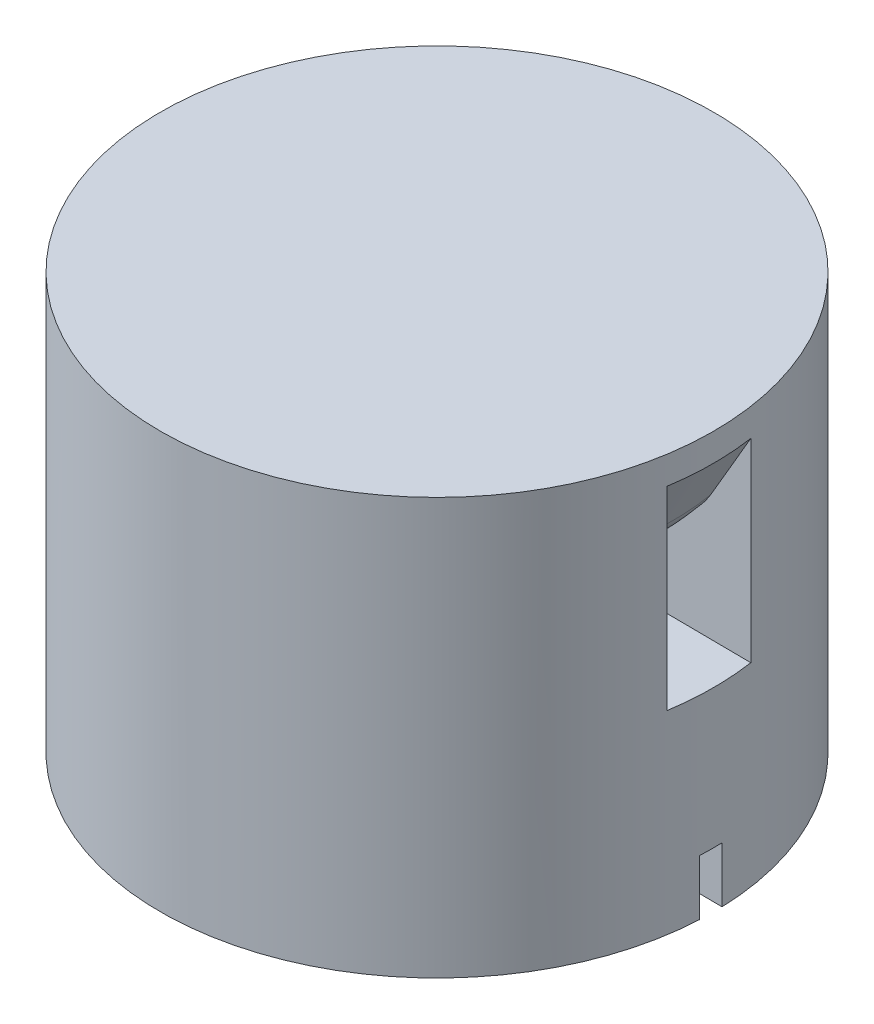
ISO-10303-21;
HEADER;
FILE_DESCRIPTION(('STEP AP214'),'2;1');
FILE_NAME('part.step','',(''),(''),'','','');
FILE_SCHEMA(('AUTOMOTIVE_DESIGN { 1 0 10303 214 1 1 1 1 }'));
ENDSEC;
DATA;
#1=APPLICATION_CONTEXT('core data for automotive mechanical design processes');
#2=APPLICATION_PROTOCOL_DEFINITION('international standard','automotive_design',2000,#1);
#3=PRODUCT_CONTEXT('',#1,'mechanical');
#4=PRODUCT('Part','Part','',(#3));
#5=PRODUCT_RELATED_PRODUCT_CATEGORY('part','',(#4));
#6=PRODUCT_DEFINITION_FORMATION('','',#4);
#7=PRODUCT_DEFINITION_CONTEXT('part definition',#1,'design');
#8=PRODUCT_DEFINITION('design','',#6,#7);
#9=PRODUCT_DEFINITION_SHAPE('','',#8);
#10=(LENGTH_UNIT() NAMED_UNIT(*) SI_UNIT(.MILLI.,.METRE.));
#11=(NAMED_UNIT(*) PLANE_ANGLE_UNIT() SI_UNIT($,.RADIAN.));
#12=(NAMED_UNIT(*) SI_UNIT($,.STERADIAN.) SOLID_ANGLE_UNIT());
#13=UNCERTAINTY_MEASURE_WITH_UNIT(LENGTH_MEASURE(1.E-05),#10,'distance_accuracy_value','');
#14=(GEOMETRIC_REPRESENTATION_CONTEXT(3) GLOBAL_UNCERTAINTY_ASSIGNED_CONTEXT((#13)) GLOBAL_UNIT_ASSIGNED_CONTEXT((#10,
#11,#12)) REPRESENTATION_CONTEXT('',''));
#15=CARTESIAN_POINT('',(0.,0.,0.));
#16=DIRECTION('',(0.,0.,1.));
#17=DIRECTION('',(1.,0.,0.));
#18=AXIS2_PLACEMENT_3D('',#15,#16,#17);
#19=CARTESIAN_POINT('',(-20.5796015309057,4.73666318432936,33.8553649507522));
#20=DIRECTION('',(0.,1.,0.));
#21=DIRECTION('',(0.999961923064181,0.,0.00872653549732342));
#22=AXIS2_PLACEMENT_3D('',#19,#20,#21);
#23=PLANE('',#22);
#24=CARTESIAN_POINT('',(-20.5796015309057,4.73666318432936,33.8553649507522));
#25=DIRECTION('',(0.,1.,0.));
#26=DIRECTION('',(0.999961923064181,0.,0.00872653549732342));
#27=AXIS2_PLACEMENT_3D('',#24,#25,#26);
#28=CIRCLE('',#27,6.32716035241819);
#29=CARTESIAN_POINT('',(-14.255565756559,4.73666318432936,33.6565443029423));
#30=VERTEX_POINT('',#29);
#31=CARTESIAN_POINT('',(-26.8992042252198,4.73666318432936,33.5462049416455));
#32=VERTEX_POINT('',#31);
#33=EDGE_CURVE('E161',#30,#32,#28,.T.);
#34=ORIENTED_EDGE('',*,*,#33,.F.);
#35=DIRECTION('',(-0.999961923064181,0.,-0.00872653549732342));
#36=VECTOR('',#35,1.);
#37=CARTESIAN_POINT('',(-20.5773849908894,4.73666318432936,33.6013746222939));
#38=LINE('',#37,#36);
#39=EDGE_CURVE('E152',#30,#32,#38,.T.);
#40=ORIENTED_EDGE('',*,*,#39,.T.);
#41=EDGE_LOOP('',(#34,#40));
#42=FACE_BOUND('',#41,.T.);
#43=ADVANCED_FACE('F42',(#42),#23,.F.);
#44=CARTESIAN_POINT('',(-20.5796015309057,14.2616631843294,33.8553649507522));
#45=DIRECTION('',(0.,-1.,0.));
#46=DIRECTION('',(-0.999961923064181,0.,-0.00872653549732342));
#47=AXIS2_PLACEMENT_3D('',#44,#45,#46);
#48=CYLINDRICAL_SURFACE('',#47,6.32716035241819);
#49=ORIENTED_EDGE('',*,*,#33,.T.);
#50=DIRECTION('',(0.,-1.,0.));
#51=VECTOR('',#50,1.);
#52=CARTESIAN_POINT('',(-26.8992042252198,14.2616631843294,33.5462049416455));
#53=LINE('',#52,#51);
#54=CARTESIAN_POINT('',(-26.8992042252198,6.00666318432936,33.5462049416455));
#55=VERTEX_POINT('',#54);
#56=EDGE_CURVE('E158',#32,#55,#53,.F.);
#57=ORIENTED_EDGE('',*,*,#56,.T.);
#58=CARTESIAN_POINT('',(-20.5796015309057,6.00666318432936,33.8553649507522));
#59=DIRECTION('',(0.,1.,0.));
#60=DIRECTION('',(0.999961923064181,0.,0.00872653549732342));
#61=AXIS2_PLACEMENT_3D('',#58,#59,#60);
#62=CIRCLE('',#61,6.32716035241819);
#63=CARTESIAN_POINT('',(-26.9036373052524,6.00666318432936,34.0541855985621));
#64=VERTEX_POINT('',#63);
#65=EDGE_CURVE('E12',#55,#64,#62,.T.);
#66=ORIENTED_EDGE('',*,*,#65,.T.);
#67=DIRECTION('',(0.,-1.,0.));
#68=VECTOR('',#67,1.);
#69=CARTESIAN_POINT('',(-26.9036373052524,14.2616631843294,34.0541855985621));
#70=LINE('',#69,#68);
#71=CARTESIAN_POINT('',(-26.9036373052524,4.73666318432936,34.0541855985621));
#72=VERTEX_POINT('',#71);
#73=EDGE_CURVE('E149',#64,#72,#70,.T.);
#74=ORIENTED_EDGE('',*,*,#73,.T.);
#75=CARTESIAN_POINT('',(-14.2599988365916,4.73666318432936,34.1645249598589));
#76=VERTEX_POINT('',#75);
#77=EDGE_CURVE('E160',#72,#76,#28,.T.);
#78=ORIENTED_EDGE('',*,*,#77,.T.);
#79=DIRECTION('',(0.,-1.,0.));
#80=VECTOR('',#79,1.);
#81=CARTESIAN_POINT('',(-14.2599988365916,14.2616631843294,34.1645249598589));
#82=LINE('',#81,#80);
#83=CARTESIAN_POINT('',(-14.2599988365916,6.00666318432936,34.1645249598589));
#84=VERTEX_POINT('',#83);
#85=EDGE_CURVE('E56',#76,#84,#82,.F.);
#86=ORIENTED_EDGE('',*,*,#85,.T.);
#87=CARTESIAN_POINT('',(-14.255565756559,6.00666318432936,33.6565443029423));
#88=VERTEX_POINT('',#87);
#89=EDGE_CURVE('E48',#84,#88,#62,.T.);
#90=ORIENTED_EDGE('',*,*,#89,.T.);
#91=DIRECTION('',(0.,-1.,0.));
#92=VECTOR('',#91,1.);
#93=CARTESIAN_POINT('',(-14.255565756559,14.2616631843294,33.6565443029423));
#94=LINE('',#93,#92);
#95=EDGE_CURVE('E300',#88,#30,#94,.T.);
#96=ORIENTED_EDGE('',*,*,#95,.T.);
#97=EDGE_LOOP('',(#49,#57,#66,#74,#78,#86,#90,#96));
#98=FACE_BOUND('',#97,.T.);
#99=DIRECTION('',(0.,-1.,0.));
#100=VECTOR('',#99,1.);
#101=CARTESIAN_POINT('',(-14.3294631343359,14.2616631843294,34.8396048345901));
#102=LINE('',#101,#100);
#103=CARTESIAN_POINT('',(-14.3294631343359,9.18166318432935,34.8396048345901));
#104=VERTEX_POINT('',#103);
#105=CARTESIAN_POINT('',(-14.3294631343359,13.6266631843293,34.8396048345901));
#106=VERTEX_POINT('',#105);
#107=EDGE_CURVE('E176',#104,#106,#102,.F.);
#108=ORIENTED_EDGE('',*,*,#107,.T.);
#109=CARTESIAN_POINT('',(-20.5796015309057,13.6266631843293,33.8553649507522));
#110=DIRECTION('',(0.,-1.,0.));
#111=DIRECTION('',(-0.999961923064181,0.,-0.00872653549732342));
#112=AXIS2_PLACEMENT_3D('',#109,#110,#111);
#113=CIRCLE('',#112,6.32716035241819);
#114=CARTESIAN_POINT('',(-14.3197947664442,13.6266631843293,32.9346166698336));
#115=VERTEX_POINT('',#114);
#116=EDGE_CURVE('E181',#106,#115,#113,.F.);
#117=ORIENTED_EDGE('',*,*,#116,.T.);
#118=DIRECTION('',(0.,-1.,0.));
#119=VECTOR('',#118,1.);
#120=CARTESIAN_POINT('',(-14.3197947664442,14.2616631843294,32.9346166698336));
#121=LINE('',#120,#119);
#122=CARTESIAN_POINT('',(-14.3197947664442,9.18166318432935,32.9346166698336));
#123=VERTEX_POINT('',#122);
#124=EDGE_CURVE('E177',#123,#115,#121,.F.);
#125=ORIENTED_EDGE('',*,*,#124,.F.);
#126=CARTESIAN_POINT('',(-20.5796015309057,9.18166318432935,33.8553649507522));
#127=DIRECTION('',(0.,-1.,0.));
#128=DIRECTION('',(-0.999961923064181,0.,-0.00872653549732342));
#129=AXIS2_PLACEMENT_3D('',#126,#127,#128);
#130=CIRCLE('',#129,6.32716035241819);
#131=EDGE_CURVE('E173',#123,#104,#130,.T.);
#132=ORIENTED_EDGE('',*,*,#131,.T.);
#133=EDGE_LOOP('',(#108,#117,#125,#132));
#134=FACE_BOUND('',#133,.T.);
#135=CARTESIAN_POINT('',(-20.5796015309057,14.2616631843294,33.8553649507522));
#136=DIRECTION('',(0.,1.,0.));
#137=DIRECTION('',(0.999961923064181,0.,0.00872653549732342));
#138=AXIS2_PLACEMENT_3D('',#135,#136,#137);
#139=CIRCLE('',#138,6.32716035241819);
#140=CARTESIAN_POINT('',(-14.2526820973661,14.2616631843294,33.9105791401648));
#141=VERTEX_POINT('',#140);
#142=EDGE_CURVE('E168',#141,#141,#139,.T.);
#143=ORIENTED_EDGE('',*,*,#142,.F.);
#144=EDGE_LOOP('',(#143));
#145=FACE_BOUND('',#144,.T.);
#146=DIRECTION('',(0.,-1.,0.));
#147=VECTOR('',#146,1.);
#148=CARTESIAN_POINT('',(-26.8297399274754,14.2616631843294,32.8711250669143));
#149=LINE('',#148,#147);
#150=CARTESIAN_POINT('',(-26.8297399274754,9.18166318432935,32.8711250669143));
#151=VERTEX_POINT('',#150);
#152=CARTESIAN_POINT('',(-26.8297399274754,13.6266631843293,32.8711250669143));
#153=VERTEX_POINT('',#152);
#154=EDGE_CURVE('E396',#151,#153,#149,.F.);
#155=ORIENTED_EDGE('',*,*,#154,.T.);
#156=CARTESIAN_POINT('',(-20.5796015309057,13.6266631843293,33.8553649507522));
#157=DIRECTION('',(0.,-1.,0.));
#158=DIRECTION('',(-0.999961923064181,0.,-0.00872653549732342));
#159=AXIS2_PLACEMENT_3D('',#156,#157,#158);
#160=CIRCLE('',#159,6.32716035241819);
#161=CARTESIAN_POINT('',(-26.8394082953672,13.6266631843293,34.7761132316707));
#162=VERTEX_POINT('',#161);
#163=EDGE_CURVE('E405',#153,#162,#160,.F.);
#164=ORIENTED_EDGE('',*,*,#163,.T.);
#165=DIRECTION('',(0.,-1.,0.));
#166=VECTOR('',#165,1.);
#167=CARTESIAN_POINT('',(-26.8394082953672,14.2616631843294,34.7761132316707));
#168=LINE('',#167,#166);
#169=CARTESIAN_POINT('',(-26.8394082953672,9.18166318432935,34.7761132316707));
#170=VERTEX_POINT('',#169);
#171=EDGE_CURVE('E404',#170,#162,#168,.F.);
#172=ORIENTED_EDGE('',*,*,#171,.F.);
#173=CARTESIAN_POINT('',(-20.5796015309057,9.18166318432935,33.8553649507522));
#174=DIRECTION('',(0.,-1.,0.));
#175=DIRECTION('',(-0.999961923064181,0.,-0.00872653549732342));
#176=AXIS2_PLACEMENT_3D('',#173,#174,#175);
#177=CIRCLE('',#176,6.32716035241819);
#178=EDGE_CURVE('E237',#170,#151,#177,.T.);
#179=ORIENTED_EDGE('',*,*,#178,.T.);
#180=EDGE_LOOP('',(#155,#164,#172,#179));
#181=FACE_BOUND('',#180,.T.);
#182=ADVANCED_FACE('F157',(#98,#134,#145,#181),#48,.T.);
#183=CARTESIAN_POINT('',(-20.5796015309057,14.2616631843294,33.8553649507522));
#184=DIRECTION('',(0.,1.,0.));
#185=DIRECTION('',(0.999961923064181,0.,0.00872653549732342));
#186=AXIS2_PLACEMENT_3D('',#183,#184,#185);
#187=PLANE('',#186);
#188=ORIENTED_EDGE('',*,*,#142,.T.);
#189=EDGE_LOOP('',(#188));
#190=FACE_BOUND('',#189,.T.);
#191=ADVANCED_FACE('F381',(#190),#187,.T.);
#192=ORIENTED_EDGE('',*,*,#77,.F.);
#193=DIRECTION('',(0.999961923064181,0.,0.00872653549732342));
#194=VECTOR('',#193,1.);
#195=CARTESIAN_POINT('',(-20.581818070922,4.73666318432936,34.1093552792105));
#196=LINE('',#195,#194);
#197=EDGE_CURVE('E141',#72,#76,#196,.T.);
#198=ORIENTED_EDGE('',*,*,#197,.T.);
#199=EDGE_LOOP('',(#192,#198));
#200=FACE_BOUND('',#199,.T.);
#201=ADVANCED_FACE('F162',(#200),#23,.F.);
#202=CARTESIAN_POINT('',(-16.800698096015,11.0866631843294,34.8180386938023));
#203=DIRECTION('',(-0.00872653549732342,0.,0.999961923064181));
#204=DIRECTION('',(0.999961923064181,0.,0.00872653549732342));
#205=AXIS2_PLACEMENT_3D('',#202,#203,#204);
#206=PLANE('',#205);
#207=DIRECTION('',(0.999961923064181,0.,0.00872653549732342));
#208=VECTOR('',#207,1.);
#209=CARTESIAN_POINT('',(-16.800698096015,9.18166318432935,34.8180386938023));
#210=LINE('',#209,#208);
#211=CARTESIAN_POINT('',(-16.800698096015,9.18166318432935,34.8180386938023));
#212=VERTEX_POINT('',#211);
#213=EDGE_CURVE('E166',#212,#104,#210,.T.);
#214=ORIENTED_EDGE('',*,*,#213,.F.);
#215=DIRECTION('',(0.,-1.,0.));
#216=VECTOR('',#215,1.);
#217=CARTESIAN_POINT('',(-16.800698096015,11.0866631843294,34.8180386938023));
#218=LINE('',#217,#216);
#219=CARTESIAN_POINT('',(-16.800698096015,11.0866631843294,34.8180386938023));
#220=VERTEX_POINT('',#219);
#221=EDGE_CURVE('E323',#220,#212,#218,.T.);
#222=ORIENTED_EDGE('',*,*,#221,.F.);
#223=CARTESIAN_POINT('',(-16.8030538802825,11.0866631843294,35.0879848330444));
#224=CARTESIAN_POINT('',(-15.912888306882,11.1959404781533,35.4262131204695));
#225=CARTESIAN_POINT('',(-15.4758623232333,12.0250606401817,35.6269684341265));
#226=CARTESIAN_POINT('',(-16.8022844277182,11.0866631843294,34.9998143023469));
#227=CARTESIAN_POINT('',(-15.8831270701397,11.1839323304118,35.3158564281265));
#228=CARTESIAN_POINT('',(-15.4294572614788,12.0289274226937,35.500127970876));
#229=CARTESIAN_POINT('',(-16.8015024867343,11.0866631843294,34.9102127405197));
#230=CARTESIAN_POINT('',(-15.8566514884843,11.1723138134788,35.2035519420654));
#231=CARTESIAN_POINT('',(-15.3884840322798,12.0316027418733,35.3713259378124));
#232=CARTESIAN_POINT('',(-16.7999209936049,11.0866631843294,34.7289915776105));
#233=CARTESIAN_POINT('',(-15.810090815764,11.1508369827565,34.9749525314659));
#234=CARTESIAN_POINT('',(-15.3171847938124,12.0353924202508,35.1108972150755));
#235=CARTESIAN_POINT('',(-16.7991214566319,11.0866631843294,34.6373737151292));
#236=CARTESIAN_POINT('',(-15.7900751606548,11.1410042154396,34.8588054751159));
#237=CARTESIAN_POINT('',(-15.2868499662938,12.0365080745684,34.9792729612657));
#238=CARTESIAN_POINT('',(-16.7975059011619,11.0866631843294,34.4522493945874));
#239=CARTESIAN_POINT('',(-15.7564571751111,11.1241761962892,34.6228260049621));
#240=CARTESIAN_POINT('',(-15.2363806260591,12.0380086630393,34.7132716460847));
#241=CARTESIAN_POINT('',(-16.7966898116893,11.0866631843294,34.3587348035276));
#242=CARTESIAN_POINT('',(-15.7429572507968,11.1172281448468,34.5031819033721));
#243=CARTESIAN_POINT('',(-15.2163097621519,12.0383890772935,34.5788826580833));
#244=CARTESIAN_POINT('',(-16.7950509930749,11.0866631843294,34.1709447906787));
#245=CARTESIAN_POINT('',(-15.7226791138119,11.1069538529172,34.2619609977699));
#246=CARTESIAN_POINT('',(-15.1865014542934,12.0388492014819,34.3089349631688));
#247=CARTESIAN_POINT('',(-16.7942282622472,11.0866631843294,34.0766691756967));
#248=CARTESIAN_POINT('',(-15.7159420241019,11.1036491064786,34.1406239329257));
#249=CARTESIAN_POINT('',(-15.1767667230621,12.0389288324894,34.1733759585907));
#250=CARTESIAN_POINT('',(-16.7925593985633,11.0866631843294,33.8854363388873));
#251=CARTESIAN_POINT('',(-15.7091929144116,11.1009812990164,33.8940010929454));
#252=CARTESIAN_POINT('',(-15.1674546099707,12.0389982665288,33.8983121679034));
#253=CARTESIAN_POINT('',(-16.7917132232895,11.0866631843294,33.7884742564847));
#254=CARTESIAN_POINT('',(-15.7093764664462,11.1017309468163,33.7689739377937));
#255=CARTESIAN_POINT('',(-15.1681532200469,12.0389856333221,33.7587980106354));
#256=CARTESIAN_POINT('',(-16.7900243724579,11.0866631843294,33.5949511193895));
#257=CARTESIAN_POINT('',(-15.7169534977315,11.1073590241231,33.5194715608639));
#258=CARTESIAN_POINT('',(-15.1804045426886,12.0388158047265,33.4802479062271));
#259=CARTESIAN_POINT('',(-16.7891816968374,11.0866631843294,33.4983900575284));
#260=CARTESIAN_POINT('',(-15.7243276245899,11.112224945274,33.3952715358657));
#261=CARTESIAN_POINT('',(-15.1919570603834,12.038658611933,33.3412119505462));
#262=CARTESIAN_POINT('',(-16.7875084674457,11.0866631843294,33.3066569601535));
#263=CARTESIAN_POINT('',(-15.7462133972077,11.1255617445163,33.1492028217574));
#264=CARTESIAN_POINT('',(-15.2259693327203,12.0378791614129,33.0650162922451));
#265=CARTESIAN_POINT('',(-16.7866778789824,11.0866631843294,33.2114809493247));
#266=CARTESIAN_POINT('',(-15.7606484577952,11.1339915542177,33.0275739242886));
#267=CARTESIAN_POINT('',(-15.248385906771,12.0372587396161,32.9278513536291));
#268=CARTESIAN_POINT('',(-16.7850319864045,11.0866631843294,33.0228803405466));
#269=CARTESIAN_POINT('',(-15.7965415953087,11.1535249298568,32.7874807583097));
#270=CARTESIAN_POINT('',(-15.3043008053302,12.0349324650543,32.6558478773494));
#271=CARTESIAN_POINT('',(-16.7842166784862,11.0866631843294,32.9294553067347));
#272=CARTESIAN_POINT('',(-15.8179274378219,11.1645957690196,32.669212162535));
#273=CARTESIAN_POINT('',(-15.3377963322284,12.0332268862084,32.5210087614137));
#274=CARTESIAN_POINT('',(-16.7823889290354,11.0866631843294,32.7200159643653));
#275=CARTESIAN_POINT('',(-15.8743333375591,11.1913037644581,32.4055821087363));
#276=CARTESIAN_POINT('',(-15.4268967415102,12.0270419832162,32.218335153356));
#277=CARTESIAN_POINT('',(-16.7813832290572,11.0866631843294,32.6047741614188));
#278=CARTESIAN_POINT('',(-15.9113942248892,11.2073476538446,32.2615311211964));
#279=CARTESIAN_POINT('',(-15.4860378993431,12.0219340702992,32.0515087609353));
#280=CARTESIAN_POINT('',(-16.7799179494628,11.0866631843294,32.4368697506123));
#281=CARTESIAN_POINT('',(-15.9752323379463,11.2303754756759,32.0522778299303));
#282=CARTESIAN_POINT('',(-15.5891972956055,12.0095076693936,31.807562536125));
#283=CARTESIAN_POINT('',(-16.7794359509849,11.0866631843294,32.3816381956612));
#284=CARTESIAN_POINT('',(-15.9978166734159,11.237859264129,31.9838417970097));
#285=CARTESIAN_POINT('',(-15.6260668731185,12.0045589357298,31.727164511409));
#286=CARTESIAN_POINT('',(-16.7784904116571,11.0866631843294,32.2732901204276));
#287=CARTESIAN_POINT('',(-16.0455640029538,11.2518413542451,31.849906396549));
#288=CARTESIAN_POINT('',(-15.7047435914254,11.9924853847285,31.5690036225623));
#289=CARTESIAN_POINT('',(-16.778026899784,11.0866631843294,32.2201769205579));
#290=CARTESIAN_POINT('',(-16.0707140952769,11.258342784007,31.7844028680854));
#291=CARTESIAN_POINT('',(-15.7465581055169,11.9853572920525,31.4912449218193));
#292=CARTESIAN_POINT('',(-16.7775750558511,11.0866631843294,32.168400734213));
#293=CARTESIAN_POINT('',(-16.0971619289419,11.2640642405146,31.7204405186824));
#294=CARTESIAN_POINT('',(-15.7908536161402,11.9768548095898,31.4151433931635));
#295=(BOUNDED_SURFACE() B_SPLINE_SURFACE(3,2,((#223,#224,#225),(#226,#227,#228),(#229,#230,
#231),(#232,#233,#234),(#235,#236,#237),(#238,#239,#240),(#241,#242,#243),(#244,#245,#246),
(#247,#248,#249),(#250,#251,#252),(#253,#254,#255),(#256,#257,#258),(#259,#260,#261),(#262,#263,
#264),(#265,#266,#267),(#268,#269,#270),(#271,#272,#273),(#274,#275,#276),(#277,#278,#279),
(#280,#281,#282),(#283,#284,#285),(#286,#287,#288),(#289,#290,#291),(#292,#293,#294)),
.UNSPECIFIED.,.F.,.F.,.F.) B_SPLINE_SURFACE_WITH_KNOTS((4,2,2,2,2,2,2,2,2,2,2,4),(3,3),(0.,
0.281563117970208,0.562892291454136,0.845945506918827,1.12907299140473,1.41970298187176,
1.71032775447867,1.99980675886128,2.28921272096391,2.6573865921971,2.8421036982575,
3.02709979003919),(0.,1.),
.UNSPECIFIED.) GEOMETRIC_REPRESENTATION_ITEM() RATIONAL_B_SPLINE_SURFACE(((1.,0.893297725100791,
1.),(1.,0.889939767838789,1.),(1.,0.886841767415509,1.),(1.,0.881305683164465,1.),(1.,
0.878867053165516,1.),(1.,0.87477116378226,1.),(1.,0.873118784377259,1.),(1.,0.870698396390802,
1.),(1.,0.869930619969068,1.),(1.,0.869311200551511,1.),(1.,0.869484373004091,1.),(1.,
0.870795378872499,1.),(1.,0.871933194969116,1.),(1.,0.875107687459947,1.),(1.,0.877140802474305,
1.),(1.,0.881993547897769,1.),(1.,0.88481297972132,1.),(1.,0.891938121342946,1.),(1.,
0.896439497702486,1.),(1.,0.903610467262528,1.),(1.,0.906075164070435,1.),(1.,0.911065752874051,
1.),(1.,0.913591731673038,1.),(1.,0.916106119327106,1.))) REPRESENTATION_ITEM('') SURFACE());
#296=CARTESIAN_POINT('',(-16.800698096015,11.0866631843294,34.8180386938023));
#297=CARTESIAN_POINT('',(-16.7448094585358,11.0909728807364,34.8185264265525));
#298=CARTESIAN_POINT('',(-16.6891207135655,11.0975724429508,34.8190124148672));
#299=CARTESIAN_POINT('',(-16.5784714161388,11.1153560931595,34.8199780366569));
#300=CARTESIAN_POINT('',(-16.5235109854837,11.1265409382397,34.8204576690689));
#301=CARTESIAN_POINT('',(-16.3603106441421,11.1669604745899,34.821881896871));
#302=CARTESIAN_POINT('',(-16.2536809758213,11.2030655487217,34.8228124398889));
#303=CARTESIAN_POINT('',(-16.0479788010567,11.2929580110288,34.8246075755721));
#304=CARTESIAN_POINT('',(-15.9489200112862,11.3467765980271,34.8254720485338));
#305=CARTESIAN_POINT('',(-15.7616553858779,11.4706680856941,34.8271062821615));
#306=CARTESIAN_POINT('',(-15.6734365200042,11.5407211731627,34.8278761565405));
#307=CARTESIAN_POINT('',(-15.5270577626221,11.6795188970586,34.8291535846034));
#308=CARTESIAN_POINT('',(-15.466424005406,11.7456773348718,34.8296827273862));
#309=CARTESIAN_POINT('',(-15.3549569832055,11.8859000441266,34.8306554853519));
#310=CARTESIAN_POINT('',(-15.3041339259297,11.9599724266458,34.8310990114534));
#311=CARTESIAN_POINT('',(-15.2588346916621,12.0373405866113,34.8314943318818));
#312=B_SPLINE_CURVE_WITH_KNOTS('',3,(#296,#297,#298,#299,#300,#301,#302,#303,#304,#305,#306,
#307,#308,#309,#310,#311),.UNSPECIFIED.,.F.,.F.,(4,2,2,2,2,2,2,4),(0.,0.168074204246265,
0.336176170768277,0.672169998943567,1.0087588087615,1.34493897622632,1.61330971868608,
1.88195820449465),.UNSPECIFIED.);
#313=CARTESIAN_POINT('',(-15.2588346916621,12.0373405866113,34.8314943318818));
#314=VERTEX_POINT('',#313);
#315=EDGE_CURVE('E353',#220,#314,#312,.T.);
#316=ORIENTED_EDGE('',*,*,#315,.T.);
#317=CARTESIAN_POINT('',(-15.81693736685,11.0866631843294,34.8266238436224));
#318=CARTESIAN_POINT('',(-15.6925794760728,11.2980943793317,34.8277090984938));
#319=CARTESIAN_POINT('',(-15.5683490125834,11.5096004643928,34.8287932413241));
#320=CARTESIAN_POINT('',(-15.3201007334797,11.9327372148142,34.8309596712349));
#321=CARTESIAN_POINT('',(-15.1960829177187,12.1443678800884,34.8320419583166));
#322=CARTESIAN_POINT('',(-14.9482175865725,12.5677288305269,34.8342050462912));
#323=CARTESIAN_POINT('',(-14.8243700711453,12.7794591156665,34.8352858471844));
#324=CARTESIAN_POINT('',(-14.5768170838979,13.2030029133262,34.837446209375));
#325=CARTESIAN_POINT('',(-14.4531116121754,13.4148164259035,34.8385257706716));
#326=CARTESIAN_POINT('',(-14.3294631343359,13.6266631843293,34.8396048345901));
#327=B_SPLINE_CURVE_WITH_KNOTS('',3,(#317,#318,#319,#320,#321,#322,#323,#324,#325,#326),
.UNSPECIFIED.,.F.,.F.,(4,2,2,2,4),(0.,0.735882282467495,1.47176405722892,2.20764564981234,
2.94352774781471),.UNSPECIFIED.);
#328=EDGE_CURVE('E183',#314,#106,#327,.T.);
#329=ORIENTED_EDGE('',*,*,#328,.T.);
#330=ORIENTED_EDGE('',*,*,#107,.F.);
#331=EDGE_LOOP('',(#214,#222,#316,#329,#330));
#332=FACE_BOUND('',#331,.T.);
#333=ADVANCED_FACE('F196',(#332),#206,.F.);
#334=CARTESIAN_POINT('',(-16.7840740458926,11.0866631843294,32.913111230365));
#335=DIRECTION('',(-0.00872653549732342,0.,0.999961923064181));
#336=DIRECTION('',(0.999961923064181,0.,0.00872653549732342));
#337=AXIS2_PLACEMENT_3D('',#334,#335,#336);
#338=PLANE('',#337);
#339=ORIENTED_EDGE('',*,*,#124,.T.);
#340=CARTESIAN_POINT('',(-14.3197947664442,13.6266631843293,32.9346166698336));
#341=CARTESIAN_POINT('',(-14.4435921279524,13.4147973348564,32.933536306627));
#342=CARTESIAN_POINT('',(-14.5674523990323,13.2029682202633,32.9324553944169));
#343=CARTESIAN_POINT('',(-14.8153297879105,12.7794020306628,32.9302922012161));
#344=CARTESIAN_POINT('',(-14.9393469055774,12.5676649555783,32.9292099202266));
#345=CARTESIAN_POINT('',(-15.1875692601678,12.1443009955697,32.9270437165556));
#346=CARTESIAN_POINT('',(-15.3117744971484,11.9326741106789,32.9259597938737));
#347=CARTESIAN_POINT('',(-15.5604199870313,11.5095582313466,32.923789897557));
#348=CARTESIAN_POINT('',(-15.6848602401315,11.2980692370213,32.9227039239205));
#349=CARTESIAN_POINT('',(-15.8094413637987,11.0866631843294,32.9216167209251));
#350=B_SPLINE_CURVE_WITH_KNOTS('',3,(#340,#341,#342,#343,#344,#345,#346,#347,#348,#349),
.UNSPECIFIED.,.F.,.F.,(4,2,2,2,4),(0.,0.736156818349454,1.47231301961745,2.20846944344556,
2.94462648716325),.UNSPECIFIED.);
#351=CARTESIAN_POINT('',(-15.250536252537,12.0370763140886,32.9264942119381));
#352=VERTEX_POINT('',#351);
#353=EDGE_CURVE('E191',#115,#352,#350,.T.);
#354=ORIENTED_EDGE('',*,*,#353,.T.);
#355=CARTESIAN_POINT('',(-15.250536252537,12.0370763140886,32.9264942119381));
#356=CARTESIAN_POINT('',(-15.2778390137806,11.9905607232254,32.9262559443505));
#357=CARTESIAN_POINT('',(-15.3071149747387,11.9452347594815,32.9260004569098));
#358=CARTESIAN_POINT('',(-15.3694031839591,11.8572363699829,32.925456875943));
#359=CARTESIAN_POINT('',(-15.4024149287438,11.8145635878529,32.9251687868108));
#360=CARTESIAN_POINT('',(-15.506501856615,11.691212773791,32.9242604339526));
#361=CARTESIAN_POINT('',(-15.5828270348037,11.6148658452114,32.9235943542135));
#362=CARTESIAN_POINT('',(-15.7471026950645,11.4759736685677,32.9221607422454));
#363=CARTESIAN_POINT('',(-15.8350568549594,11.4134328036329,32.9213931779204));
#364=CARTESIAN_POINT('',(-16.0200959275737,11.3036305723295,32.9197783663978));
#365=CARTESIAN_POINT('',(-16.1171855911435,11.2563772134385,32.9189310777401));
#366=CARTESIAN_POINT('',(-16.308117313697,11.1819600916156,32.9172648418405));
#367=CARTESIAN_POINT('',(-16.4013803810484,11.1533060970632,32.916450947382));
#368=CARTESIAN_POINT('',(-16.5435321723925,11.120611513416,32.9152104074929));
#369=CARTESIAN_POINT('',(-16.5912910250869,11.111427825716,32.9147936222996));
#370=CARTESIAN_POINT('',(-16.6873392166443,11.09648172153,32.9139554224305));
#371=CARTESIAN_POINT('',(-16.7356285300217,11.0907191414047,32.913534007977));
#372=CARTESIAN_POINT('',(-16.7840740458926,11.0866631843294,32.913111230365));
#373=B_SPLINE_CURVE_WITH_KNOTS('',3,(#355,#356,#357,#358,#359,#360,#361,#362,#363,#364,#365,
#366,#367,#368,#369,#370,#371,#372),.UNSPECIFIED.,.F.,.F.,(4,2,2,2,2,2,2,2,4),(0.,
0.161708880496811,0.323395993128269,0.645613715189035,0.96793358781669,1.2904220167878,
1.58203584267801,1.72783514402164,1.87362747089792),.UNSPECIFIED.);
#374=CARTESIAN_POINT('',(-16.7840740458926,11.0866631843294,32.913111230365));
#375=VERTEX_POINT('',#374);
#376=EDGE_CURVE('E357',#352,#375,#373,.T.);
#377=ORIENTED_EDGE('',*,*,#376,.T.);
#378=DIRECTION('',(0.,-1.,0.));
#379=VECTOR('',#378,1.);
#380=CARTESIAN_POINT('',(-16.7840740458926,11.0866631843294,32.913111230365));
#381=LINE('',#380,#379);
#382=CARTESIAN_POINT('',(-16.7840740458926,9.18166318432935,32.913111230365));
#383=VERTEX_POINT('',#382);
#384=EDGE_CURVE('E334',#375,#383,#381,.T.);
#385=ORIENTED_EDGE('',*,*,#384,.T.);
#386=DIRECTION('',(0.999961923064181,0.,0.00872653549732342));
#387=VECTOR('',#386,1.);
#388=CARTESIAN_POINT('',(-16.7840740458926,9.18166318432935,32.913111230365));
#389=LINE('',#388,#387);
#390=EDGE_CURVE('E165',#383,#123,#389,.T.);
#391=ORIENTED_EDGE('',*,*,#390,.T.);
#392=EDGE_LOOP('',(#339,#354,#377,#385,#391));
#393=FACE_BOUND('',#392,.T.);
#394=ADVANCED_FACE('F348',(#393),#338,.T.);
#395=CARTESIAN_POINT('',(-16.800698096015,9.18166318432935,34.8180386938023));
#396=DIRECTION('',(0.,-1.,0.));
#397=DIRECTION('',(-0.999961923064181,0.,-0.00872653549732342));
#398=AXIS2_PLACEMENT_3D('',#395,#396,#397);
#399=PLANE('',#398);
#400=ORIENTED_EDGE('',*,*,#390,.F.);
#401=DIRECTION('',(0.00872653549732342,0.,-0.999961923064181));
#402=VECTOR('',#401,1.);
#403=CARTESIAN_POINT('',(-16.800698096015,9.18166318432935,34.8180386938023));
#404=LINE('',#403,#402);
#405=EDGE_CURVE('E326',#212,#383,#404,.T.);
#406=ORIENTED_EDGE('',*,*,#405,.F.);
#407=ORIENTED_EDGE('',*,*,#213,.T.);
#408=ORIENTED_EDGE('',*,*,#131,.F.);
#409=EDGE_LOOP('',(#400,#406,#407,#408));
#410=FACE_BOUND('',#409,.T.);
#411=ADVANCED_FACE('F338',(#410),#399,.F.);
#412=CARTESIAN_POINT('',(-16.7027910703091,4.73666318432936,23.5990047786322));
#413=DIRECTION('',(0.999961923064181,0.,0.00872653549732342));
#414=DIRECTION('',(0.00872653549732342,0.,-0.999961923064181));
#415=AXIS2_PLACEMENT_3D('',#412,#413,#414);
#416=PLANE('',#415);
#417=ORIENTED_EDGE('',*,*,#221,.T.);
#418=ORIENTED_EDGE('',*,*,#405,.T.);
#419=ORIENTED_EDGE('',*,*,#384,.F.);
#420=DIRECTION('',(0.00872653549732342,0.,-0.999961923064181));
#421=VECTOR('',#420,1.);
#422=CARTESIAN_POINT('',(-16.800698096015,11.0866631843294,34.8180386938023));
#423=LINE('',#422,#421);
#424=EDGE_CURVE('E331',#220,#375,#423,.T.);
#425=ORIENTED_EDGE('',*,*,#424,.F.);
#426=EDGE_LOOP('',(#417,#418,#419,#425));
#427=FACE_BOUND('',#426,.T.);
#428=ADVANCED_FACE('F209',(#427),#416,.T.);
#429=CARTESIAN_POINT('',(-20.5796015309057,11.0866631843294,33.8553649507522));
#430=DIRECTION('',(0.,1.,0.));
#431=DIRECTION('',(0.999961923064181,0.,0.00872653549732342));
#432=AXIS2_PLACEMENT_3D('',#429,#430,#431);
#433=CONICAL_SURFACE('',#432,4.86069066867656,0.523598775598297);
#434=ORIENTED_EDGE('',*,*,#328,.F.);
#435=CARTESIAN_POINT('',(-15.4758623232333,12.0250606401817,35.6269684341265));
#436=CARTESIAN_POINT('',(-15.4294572614788,12.0289274226937,35.500127970876));
#437=CARTESIAN_POINT('',(-15.3884840322798,12.0316027418733,35.3713259378124));
#438=CARTESIAN_POINT('',(-15.3171847938124,12.0353924202508,35.1108972150755));
#439=CARTESIAN_POINT('',(-15.2868499662938,12.0365080745684,34.9792729612657));
#440=CARTESIAN_POINT('',(-15.2363806260591,12.0380086630393,34.7132716460847));
#441=CARTESIAN_POINT('',(-15.2163097621519,12.0383890772935,34.5788826580833));
#442=CARTESIAN_POINT('',(-15.1865014542934,12.0388492014819,34.3089349631688));
#443=CARTESIAN_POINT('',(-15.1767667230621,12.0389288324895,34.1733759585907));
#444=CARTESIAN_POINT('',(-15.1674546099707,12.0389982665288,33.8983121679034));
#445=CARTESIAN_POINT('',(-15.1681532200469,12.0389856333221,33.7587980106354));
#446=CARTESIAN_POINT('',(-15.1804045426886,12.0388158047265,33.4802479062271));
#447=CARTESIAN_POINT('',(-15.1919570603834,12.038658611933,33.3412119505462));
#448=CARTESIAN_POINT('',(-15.2259693327203,12.0378791614129,33.0650162922451));
#449=CARTESIAN_POINT('',(-15.248385906771,12.0372587396161,32.9278513536291));
#450=CARTESIAN_POINT('',(-15.3043008053302,12.0349324650543,32.6558478773494));
#451=CARTESIAN_POINT('',(-15.3377963322284,12.0332268862084,32.5210087614137));
#452=CARTESIAN_POINT('',(-15.4268967415102,12.0270419832162,32.218335153356));
#453=CARTESIAN_POINT('',(-15.4860378993431,12.0219340702992,32.0515087609353));
#454=CARTESIAN_POINT('',(-15.5891972956055,12.0095076693936,31.807562536125));
#455=CARTESIAN_POINT('',(-15.6260668731185,12.0045589357298,31.727164511409));
#456=CARTESIAN_POINT('',(-15.7047435914254,11.9924853847285,31.5690036225623));
#457=CARTESIAN_POINT('',(-15.7465581055169,11.9853572920525,31.4912449218193));
#458=CARTESIAN_POINT('',(-15.7908536161402,11.9768548095898,31.4151433931635));
#459=B_SPLINE_CURVE_WITH_KNOTS('',3,(#435,#436,#437,#438,#439,#440,#441,#442,#443,#444,#445,
#446,#447,#448,#449,#450,#451,#452,#453,#454,#455,#456,#457,#458),.UNSPECIFIED.,.F.,.F.,(4,2,2,
2,2,2,2,2,2,2,2,4),(0.,0.281563117970208,0.562892291454136,0.845945506918827,1.12907299140473,
1.41970298187176,1.71032775447867,1.99980675886128,2.28921272096391,2.6573865921971,
2.8421036982575,3.02709979003919),.UNSPECIFIED.);
#460=EDGE_CURVE('E356',#314,#352,#459,.T.);
#461=ORIENTED_EDGE('',*,*,#460,.T.);
#462=ORIENTED_EDGE('',*,*,#353,.F.);
#463=ORIENTED_EDGE('',*,*,#116,.F.);
#464=EDGE_LOOP('',(#434,#461,#462,#463));
#465=FACE_BOUND('',#464,.T.);
#466=ADVANCED_FACE('F205',(#465),#433,.T.);
#467=ORIENTED_EDGE('',*,*,#376,.F.);
#468=ORIENTED_EDGE('',*,*,#460,.F.);
#469=ORIENTED_EDGE('',*,*,#315,.F.);
#470=ORIENTED_EDGE('',*,*,#424,.T.);
#471=EDGE_LOOP('',(#467,#468,#469,#470));
#472=FACE_BOUND('',#471,.T.);
#473=ADVANCED_FACE('F206',(#472),#295,.T.);
#474=CARTESIAN_POINT('',(-24.3585049657964,11.0866631843294,32.8926912077021));
#475=DIRECTION('',(0.00872653549732342,0.,-0.999961923064181));
#476=DIRECTION('',(-0.999961923064181,0.,-0.00872653549732342));
#477=AXIS2_PLACEMENT_3D('',#474,#475,#476);
#478=PLANE('',#477);
#479=DIRECTION('',(-0.999961923064181,0.,-0.00872653549732342));
#480=VECTOR('',#479,1.);
#481=CARTESIAN_POINT('',(-24.3585049657964,9.18166318432935,32.8926912077021));
#482=LINE('',#481,#480);
#483=CARTESIAN_POINT('',(-24.3585049657964,9.18166318432935,32.8926912077021));
#484=VERTEX_POINT('',#483);
#485=EDGE_CURVE('E318',#484,#151,#482,.T.);
#486=ORIENTED_EDGE('',*,*,#485,.F.);
#487=DIRECTION('',(0.,-1.,0.));
#488=VECTOR('',#487,1.);
#489=CARTESIAN_POINT('',(-24.3585049657964,11.0866631843294,32.8926912077021));
#490=LINE('',#489,#488);
#491=CARTESIAN_POINT('',(-24.3585049657964,11.0866631843294,32.8926912077021));
#492=VERTEX_POINT('',#491);
#493=EDGE_CURVE('E307',#492,#484,#490,.T.);
#494=ORIENTED_EDGE('',*,*,#493,.F.);
#495=CARTESIAN_POINT('',(-24.3561491815288,11.0866631843294,32.62274506846));
#496=CARTESIAN_POINT('',(-25.2463147549294,11.1959404781533,32.2845167810349));
#497=CARTESIAN_POINT('',(-25.683340738578,12.0250606401817,32.0837614673779));
#498=CARTESIAN_POINT('',(-24.3569186340932,11.0866631843294,32.7109155991575));
#499=CARTESIAN_POINT('',(-25.2760759916717,11.1839323304118,32.3948734733779));
#500=CARTESIAN_POINT('',(-25.7297458003325,12.0289274226937,32.2106019306283));
#501=CARTESIAN_POINT('',(-24.357700575077,11.0866631843294,32.8005171609847));
#502=CARTESIAN_POINT('',(-25.3025515733271,11.1723138134788,32.507177959439));
#503=CARTESIAN_POINT('',(-25.7707190295316,12.0316027418733,32.339403963692));
#504=CARTESIAN_POINT('',(-24.3592820682064,11.0866631843294,32.9817383238939));
#505=CARTESIAN_POINT('',(-25.3491122460474,11.1508369827565,32.7357773700385));
#506=CARTESIAN_POINT('',(-25.8420182679989,12.0353924202508,32.5998326864289));
#507=CARTESIAN_POINT('',(-24.3600816051795,11.0866631843294,33.0733561863752));
#508=CARTESIAN_POINT('',(-25.3691279011565,11.1410042154396,32.8519244263885));
#509=CARTESIAN_POINT('',(-25.8723530955175,12.0365080745684,32.7314569402387));
#510=CARTESIAN_POINT('',(-24.3616971606495,11.0866631843294,33.258480506917));
#511=CARTESIAN_POINT('',(-25.4027458867002,11.1241761962892,33.0879038965423));
#512=CARTESIAN_POINT('',(-25.9228224357522,12.0380086630393,32.9974582554197));
#513=CARTESIAN_POINT('',(-24.3625132501221,11.0866631843294,33.3519950979768));
#514=CARTESIAN_POINT('',(-25.4162458110146,11.1172281448469,33.2075479981323));
#515=CARTESIAN_POINT('',(-25.9428932996594,12.0383890772935,33.1318472434211));
#516=CARTESIAN_POINT('',(-24.3641520687364,11.0866631843294,33.5397851108257));
#517=CARTESIAN_POINT('',(-25.4365239479994,11.1069538529172,33.4487689037345));
#518=CARTESIAN_POINT('',(-25.9727016075179,12.0388492014819,33.4017949383356));
#519=CARTESIAN_POINT('',(-24.3649747995642,11.0866631843294,33.6340607258077));
#520=CARTESIAN_POINT('',(-25.4432610377095,11.1036491064786,33.5701059685787));
#521=CARTESIAN_POINT('',(-25.9824363387493,12.0389288324895,33.5373539429137));
#522=CARTESIAN_POINT('',(-24.3666436632481,11.0866631843294,33.825293562617));
#523=CARTESIAN_POINT('',(-25.4500101473997,11.1009812990164,33.816728808559));
#524=CARTESIAN_POINT('',(-25.9917484518407,12.0389982665288,33.812417733601));
#525=CARTESIAN_POINT('',(-24.3674898385218,11.0866631843294,33.9222556450197));
#526=CARTESIAN_POINT('',(-25.4498265953652,11.1017309468163,33.9417559637107));
#527=CARTESIAN_POINT('',(-25.9910498417645,12.0389856333221,33.951931890869));
#528=CARTESIAN_POINT('',(-24.3691786893535,11.0866631843294,34.1157787821149));
#529=CARTESIAN_POINT('',(-25.4422495640799,11.1073590241231,34.1912583406405));
#530=CARTESIAN_POINT('',(-25.9787985191228,12.0388158047265,34.2304819952773));
#531=CARTESIAN_POINT('',(-24.370021364974,11.0866631843294,34.212339843976));
#532=CARTESIAN_POINT('',(-25.4348754372214,11.112224945274,34.3154583656387));
#533=CARTESIAN_POINT('',(-25.967246001428,12.038658611933,34.3695179509582));
#534=CARTESIAN_POINT('',(-24.3716945943657,11.0866631843294,34.4040729413509));
#535=CARTESIAN_POINT('',(-25.4129896646036,11.1255617445163,34.561527079747));
#536=CARTESIAN_POINT('',(-25.9332337290911,12.0378791614129,34.6457136092593));
#537=CARTESIAN_POINT('',(-24.3725251828289,11.0866631843294,34.4992489521797));
#538=CARTESIAN_POINT('',(-25.3985546040161,11.1339915542177,34.6831559772158));
#539=CARTESIAN_POINT('',(-25.9108171550404,12.0372587396161,34.7828785478753));
#540=CARTESIAN_POINT('',(-24.3741710754068,11.0866631843294,34.6878495609578));
#541=CARTESIAN_POINT('',(-25.3626614665026,11.1535249298568,34.9232491431947));
#542=CARTESIAN_POINT('',(-25.8549022564811,12.0349324650543,35.054882024155));
#543=CARTESIAN_POINT('',(-24.3749863833251,11.0866631843294,34.7812745947697));
#544=CARTESIAN_POINT('',(-25.3412756239894,11.1645957690196,35.0415177389694));
#545=CARTESIAN_POINT('',(-25.821406729583,12.0332268862084,35.1897211400907));
#546=CARTESIAN_POINT('',(-24.376814132776,11.0866631843294,34.9907139371391));
#547=CARTESIAN_POINT('',(-25.2848697242522,11.1913037644581,35.3051477927681));
#548=CARTESIAN_POINT('',(-25.7323063203012,12.0270419832162,35.4923947481484));
#549=CARTESIAN_POINT('',(-24.3778198327541,11.0866631843294,35.1059557400856));
#550=CARTESIAN_POINT('',(-25.2478088369222,11.2073476538446,35.449198780308));
#551=CARTESIAN_POINT('',(-25.6731651624682,12.0219340702992,35.6592211405691));
#552=CARTESIAN_POINT('',(-24.3792851123485,11.0866631843294,35.2738601508921));
#553=CARTESIAN_POINT('',(-25.1839707238651,11.2303754756759,35.6584520715741));
#554=CARTESIAN_POINT('',(-25.5700057662058,12.0095076693936,35.9031673653794));
#555=CARTESIAN_POINT('',(-24.3797671108264,11.0866631843294,35.3290917058432));
#556=CARTESIAN_POINT('',(-25.1613863883955,11.237859264129,35.7268881044946));
#557=CARTESIAN_POINT('',(-25.5331361886929,12.0045589357298,35.9835653900953));
#558=CARTESIAN_POINT('',(-24.3807126501542,11.0866631843294,35.4374397810768));
#559=CARTESIAN_POINT('',(-25.1136390588575,11.2518413542451,35.8608235049553));
#560=CARTESIAN_POINT('',(-25.4544594703859,11.9924853847285,36.1417262789421));
#561=CARTESIAN_POINT('',(-24.3811761620274,11.0866631843294,35.4905529809465));
#562=CARTESIAN_POINT('',(-25.0884889665344,11.258342784007,35.926327033419));
#563=CARTESIAN_POINT('',(-25.4126449562945,11.9853572920525,36.2194849796851));
#564=CARTESIAN_POINT('',(-24.3816280059603,11.0866631843294,35.5423291672914));
#565=CARTESIAN_POINT('',(-25.0620411328694,11.2640642405146,35.9902893828219));
#566=CARTESIAN_POINT('',(-25.3683494456712,11.9768548095898,36.2955865083409));
#567=(BOUNDED_SURFACE() B_SPLINE_SURFACE(3,2,((#495,#496,#497),(#498,#499,#500),(#501,#502,
#503),(#504,#505,#506),(#507,#508,#509),(#510,#511,#512),(#513,#514,#515),(#516,#517,#518),
(#519,#520,#521),(#522,#523,#524),(#525,#526,#527),(#528,#529,#530),(#531,#532,#533),(#534,#535,
#536),(#537,#538,#539),(#540,#541,#542),(#543,#544,#545),(#546,#547,#548),(#549,#550,#551),
(#552,#553,#554),(#555,#556,#557),(#558,#559,#560),(#561,#562,#563),(#564,#565,#566)),
.UNSPECIFIED.,.F.,.F.,.F.) B_SPLINE_SURFACE_WITH_KNOTS((4,2,2,2,2,2,2,2,2,2,2,4),(3,3),(0.,
0.281563117970208,0.562892291454136,0.845945506918827,1.12907299140473,1.41970298187176,
1.71032775447867,1.99980675886128,2.28921272096391,2.65738659219708,2.84210369825747,
3.02709979003917),(0.,1.),
.UNSPECIFIED.) GEOMETRIC_REPRESENTATION_ITEM() RATIONAL_B_SPLINE_SURFACE(((1.,0.893297725100792,
1.),(1.,0.889939767838791,1.),(1.,0.886841767415511,1.),(1.,0.881305683164467,1.),(1.,
0.878867053165517,1.),(1.,0.874771163782262,1.),(1.,0.873118784377261,1.),(1.,0.870698396390804,
1.),(1.,0.869930619969069,1.),(1.,0.869311200551512,1.),(1.,0.869484373004092,1.),(1.,
0.870795378872501,1.),(1.,0.871933194969117,1.),(1.,0.875107687459948,1.),(1.,0.877140802474307,
1.),(1.,0.881993547897771,1.),(1.,0.884812979721322,1.),(1.,0.891938121342946,1.),(1.,
0.896439497702487,1.),(1.,0.903610467262529,1.),(1.,0.906075164070436,1.),(1.,0.911065752874051,
1.),(1.,0.913591731673039,1.),(1.,0.916106119327106,1.))) REPRESENTATION_ITEM('') SURFACE());
#568=CARTESIAN_POINT('',(-24.3585049657964,11.0866631843294,32.8926912077021));
#569=CARTESIAN_POINT('',(-24.4143936032736,11.0909728807373,32.8922034749519));
#570=CARTESIAN_POINT('',(-24.4700823482422,11.0975724429511,32.8917174866372));
#571=CARTESIAN_POINT('',(-24.5807316456657,11.1153560931576,32.8907518648476));
#572=CARTESIAN_POINT('',(-24.6356920763192,11.1265409382362,32.8902722324356));
#573=CARTESIAN_POINT('',(-24.7988924176629,11.1669604745851,32.8888480046335));
#574=CARTESIAN_POINT('',(-24.9055220859865,11.20306554872,32.8879174616155));
#575=CARTESIAN_POINT('',(-25.1112242607541,11.2929580110288,32.8861223259323));
#576=CARTESIAN_POINT('',(-25.2102830505249,11.3467765980249,32.8852578529705));
#577=CARTESIAN_POINT('',(-25.3975476759326,11.470668085692,32.8836236193429));
#578=CARTESIAN_POINT('',(-25.4857665418053,11.540721173163,32.8828537449639));
#579=CARTESIAN_POINT('',(-25.632145299189,11.6795188970567,32.881576316901));
#580=CARTESIAN_POINT('',(-25.6927790564068,11.745677334866,32.8810471741182));
#581=CARTESIAN_POINT('',(-25.8042460786099,11.8859000441184,32.8800744161525));
#582=CARTESIAN_POINT('',(-25.8550691358864,11.9599724266394,32.879630890051));
#583=CARTESIAN_POINT('',(-25.9003683701493,12.0373405866113,32.8792355696226));
#584=B_SPLINE_CURVE_WITH_KNOTS('',3,(#568,#569,#570,#571,#572,#573,#574,#575,#576,#577,#578,
#579,#580,#581,#582,#583),.UNSPECIFIED.,.F.,.F.,(4,2,2,2,2,2,2,4),(0.,0.168074204241037,
0.336176170757438,0.672169998943781,1.00875880875937,1.3449389762268,1.61330971868134,
1.88195820449603),.UNSPECIFIED.);
#585=CARTESIAN_POINT('',(-25.9003683701493,12.0373405866113,32.8792355696226));
#586=VERTEX_POINT('',#585);
#587=EDGE_CURVE('E70',#492,#586,#584,.T.);
#588=ORIENTED_EDGE('',*,*,#587,.T.);
#589=CARTESIAN_POINT('',(-25.3422656949613,11.0866631843294,32.884106057882));
#590=CARTESIAN_POINT('',(-25.4666235857386,11.2980943793317,32.8830208030106));
#591=CARTESIAN_POINT('',(-25.5908540492279,11.5096004643928,32.8819366601803));
#592=CARTESIAN_POINT('',(-25.8391023283316,11.9327372148142,32.8797702302695));
#593=CARTESIAN_POINT('',(-25.9631201440926,12.1443678800884,32.8786879431878));
#594=CARTESIAN_POINT('',(-26.2109854752388,12.5677288305269,32.8765248552132));
#595=CARTESIAN_POINT('',(-26.3348329906661,12.7794591156665,32.87544405432));
#596=CARTESIAN_POINT('',(-26.5823859779135,13.2030029133263,32.8732836921294));
#597=CARTESIAN_POINT('',(-26.7060914496359,13.4148164259035,32.8722041308328));
#598=CARTESIAN_POINT('',(-26.8297399274754,13.6266631843293,32.8711250669143));
#599=B_SPLINE_CURVE_WITH_KNOTS('',3,(#589,#590,#591,#592,#593,#594,#595,#596,#597,#598),
.UNSPECIFIED.,.F.,.F.,(4,2,2,2,4),(0.,0.735882282467498,1.47176405722893,2.20764564981235,
2.94352774781473),.UNSPECIFIED.);
#600=EDGE_CURVE('E259',#586,#153,#599,.T.);
#601=ORIENTED_EDGE('',*,*,#600,.T.);
#602=ORIENTED_EDGE('',*,*,#154,.F.);
#603=EDGE_LOOP('',(#486,#494,#588,#601,#602));
#604=FACE_BOUND('',#603,.T.);
#605=ADVANCED_FACE('F222',(#604),#478,.F.);
#606=CARTESIAN_POINT('',(-24.3751290159188,11.0866631843294,34.7976186711394));
#607=DIRECTION('',(0.00872653549732342,0.,-0.999961923064181));
#608=DIRECTION('',(-0.999961923064181,0.,-0.00872653549732342));
#609=AXIS2_PLACEMENT_3D('',#606,#607,#608);
#610=PLANE('',#609);
#611=ORIENTED_EDGE('',*,*,#171,.T.);
#612=CARTESIAN_POINT('',(-26.8394082953672,13.6266631843293,34.7761132316707));
#613=CARTESIAN_POINT('',(-26.715610933859,13.4147973348564,34.7771935948774));
#614=CARTESIAN_POINT('',(-26.5917506627791,13.2029682202633,34.7782745070875));
#615=CARTESIAN_POINT('',(-26.3438732739008,12.7794020306628,34.7804377002883));
#616=CARTESIAN_POINT('',(-26.219856156234,12.5676649555783,34.7815199812778));
#617=CARTESIAN_POINT('',(-25.9716338016435,12.1443009955697,34.7836861849488));
#618=CARTESIAN_POINT('',(-25.8474285646629,11.9326741106789,34.7847701076307));
#619=CARTESIAN_POINT('',(-25.59878307478,11.5095582313466,34.7869400039474));
#620=CARTESIAN_POINT('',(-25.4743428216799,11.2980692370213,34.7880259775839));
#621=CARTESIAN_POINT('',(-25.3497616980127,11.0866631843294,34.7891131805793));
#622=B_SPLINE_CURVE_WITH_KNOTS('',3,(#612,#613,#614,#615,#616,#617,#618,#619,#620,#621),
.UNSPECIFIED.,.F.,.F.,(4,2,2,2,4),(0.,0.736156818349462,1.47231301961746,2.20846944344557,
2.94462648716326),.UNSPECIFIED.);
#623=CARTESIAN_POINT('',(-25.9086668092744,12.0370763140886,34.7842356895663));
#624=VERTEX_POINT('',#623);
#625=EDGE_CURVE('E267',#162,#624,#622,.T.);
#626=ORIENTED_EDGE('',*,*,#625,.T.);
#627=CARTESIAN_POINT('',(-25.9086668092744,12.0370763140886,34.7842356895663));
#628=CARTESIAN_POINT('',(-25.8813640480312,11.9905607232262,34.7844739571539));
#629=CARTESIAN_POINT('',(-25.8520880870736,11.945234759483,34.7847294445946));
#630=CARTESIAN_POINT('',(-25.7897998778543,11.8572363699857,34.7852730255614));
#631=CARTESIAN_POINT('',(-25.7567881330702,11.8145635878563,34.7855611146936));
#632=CARTESIAN_POINT('',(-25.6527012051988,11.6912127737935,34.7864694675518));
#633=CARTESIAN_POINT('',(-25.5763760270089,11.6148658452127,34.7871355472908));
#634=CARTESIAN_POINT('',(-25.4121003667466,11.4759736685673,34.788569159259));
#635=CARTESIAN_POINT('',(-25.3241462068516,11.4134328036317,34.789336723584));
#636=CARTESIAN_POINT('',(-25.1391071342372,11.3036305723287,34.7909515351066));
#637=CARTESIAN_POINT('',(-25.0420174706674,11.2563772134387,34.7917988237643));
#638=CARTESIAN_POINT('',(-24.851085748112,11.1819600916143,34.7934650596639));
#639=CARTESIAN_POINT('',(-24.7578226807584,11.1533060970601,34.7942789541224));
#640=CARTESIAN_POINT('',(-24.615670889413,11.1206115134138,34.7955194940115));
#641=CARTESIAN_POINT('',(-24.5679120367198,11.1114278257148,34.7959362792048));
#642=CARTESIAN_POINT('',(-24.4718638451646,11.0964817215301,34.7967744790739));
#643=CARTESIAN_POINT('',(-24.4235745317884,11.0907191414052,34.7971958935274));
#644=CARTESIAN_POINT('',(-24.3751290159188,11.0866631843294,34.7976186711394));
#645=B_SPLINE_CURVE_WITH_KNOTS('',3,(#627,#628,#629,#630,#631,#632,#633,#634,#635,#636,#637,
#638,#639,#640,#641,#642,#643,#644),.UNSPECIFIED.,.F.,.F.,(4,2,2,2,2,2,2,2,4),(0.,
0.161708880494266,0.323395993123109,0.64561371518902,0.967933587817956,1.29042201678789,
1.58203584268574,1.72783514402535,1.87362747089811),.UNSPECIFIED.);
#646=CARTESIAN_POINT('',(-24.3751290159188,11.0866631843294,34.7976186711394));
#647=VERTEX_POINT('',#646);
#648=EDGE_CURVE('E155',#624,#647,#645,.T.);
#649=ORIENTED_EDGE('',*,*,#648,.T.);
#650=DIRECTION('',(0.,-1.,0.));
#651=VECTOR('',#650,1.);
#652=CARTESIAN_POINT('',(-24.3751290159188,11.0866631843294,34.7976186711394));
#653=LINE('',#652,#651);
#654=CARTESIAN_POINT('',(-24.3751290159188,9.18166318432935,34.7976186711394));
#655=VERTEX_POINT('',#654);
#656=EDGE_CURVE('E314',#647,#655,#653,.T.);
#657=ORIENTED_EDGE('',*,*,#656,.T.);
#658=DIRECTION('',(-0.999961923064181,0.,-0.00872653549732342));
#659=VECTOR('',#658,1.);
#660=CARTESIAN_POINT('',(-24.3751290159188,9.18166318432935,34.7976186711394));
#661=LINE('',#660,#659);
#662=EDGE_CURVE('E324',#655,#170,#661,.T.);
#663=ORIENTED_EDGE('',*,*,#662,.T.);
#664=EDGE_LOOP('',(#611,#626,#649,#657,#663));
#665=FACE_BOUND('',#664,.T.);
#666=ADVANCED_FACE('F408',(#665),#610,.T.);
#667=CARTESIAN_POINT('',(-24.3585049657964,9.18166318432935,32.8926912077021));
#668=DIRECTION('',(0.,-1.,0.));
#669=DIRECTION('',(-0.999961923064181,0.,-0.00872653549732342));
#670=AXIS2_PLACEMENT_3D('',#667,#668,#669);
#671=PLANE('',#670);
#672=ORIENTED_EDGE('',*,*,#178,.F.);
#673=ORIENTED_EDGE('',*,*,#662,.F.);
#674=DIRECTION('',(-0.00872653549732342,0.,0.999961923064181));
#675=VECTOR('',#674,1.);
#676=CARTESIAN_POINT('',(-24.3585049657964,9.18166318432935,32.8926912077021));
#677=LINE('',#676,#675);
#678=EDGE_CURVE('E315',#484,#655,#677,.T.);
#679=ORIENTED_EDGE('',*,*,#678,.F.);
#680=ORIENTED_EDGE('',*,*,#485,.T.);
#681=EDGE_LOOP('',(#672,#673,#679,#680));
#682=FACE_BOUND('',#681,.T.);
#683=ADVANCED_FACE('F413',(#682),#671,.F.);
#684=CARTESIAN_POINT('',(-24.4564119915023,4.73666318432936,44.1117251228722));
#685=DIRECTION('',(-0.999961923064181,0.,-0.00872653549732342));
#686=DIRECTION('',(-0.00872653549732342,0.,0.999961923064181));
#687=AXIS2_PLACEMENT_3D('',#684,#685,#686);
#688=PLANE('',#687);
#689=ORIENTED_EDGE('',*,*,#493,.T.);
#690=ORIENTED_EDGE('',*,*,#678,.T.);
#691=ORIENTED_EDGE('',*,*,#656,.F.);
#692=DIRECTION('',(-0.00872653549732342,0.,0.999961923064181));
#693=VECTOR('',#692,1.);
#694=CARTESIAN_POINT('',(-24.3585049657964,11.0866631843294,32.8926912077021));
#695=LINE('',#694,#693);
#696=EDGE_CURVE('E320',#492,#647,#695,.T.);
#697=ORIENTED_EDGE('',*,*,#696,.F.);
#698=EDGE_LOOP('',(#689,#690,#691,#697));
#699=FACE_BOUND('',#698,.T.);
#700=ADVANCED_FACE('F248',(#699),#688,.T.);
#701=CARTESIAN_POINT('',(-20.5796015309057,11.0866631843294,33.8553649507522));
#702=DIRECTION('',(0.,1.,0.));
#703=DIRECTION('',(0.999961923064181,0.,0.00872653549732342));
#704=AXIS2_PLACEMENT_3D('',#701,#702,#703);
#705=CONICAL_SURFACE('',#704,4.86069066867655,0.523598775598297);
#706=ORIENTED_EDGE('',*,*,#600,.F.);
#707=CARTESIAN_POINT('',(-25.683340738578,12.0250606401817,32.0837614673779));
#708=CARTESIAN_POINT('',(-25.7297458003325,12.0289274226937,32.2106019306283));
#709=CARTESIAN_POINT('',(-25.7707190295316,12.0316027418733,32.339403963692));
#710=CARTESIAN_POINT('',(-25.8420182679989,12.0353924202508,32.5998326864289));
#711=CARTESIAN_POINT('',(-25.8723530955175,12.0365080745684,32.7314569402387));
#712=CARTESIAN_POINT('',(-25.9228224357522,12.0380086630393,32.9974582554197));
#713=CARTESIAN_POINT('',(-25.9428932996594,12.0383890772935,33.1318472434211));
#714=CARTESIAN_POINT('',(-25.9727016075179,12.0388492014819,33.4017949383356));
#715=CARTESIAN_POINT('',(-25.9824363387493,12.0389288324895,33.5373539429137));
#716=CARTESIAN_POINT('',(-25.9917484518407,12.0389982665288,33.812417733601));
#717=CARTESIAN_POINT('',(-25.9910498417645,12.0389856333221,33.951931890869));
#718=CARTESIAN_POINT('',(-25.9787985191228,12.0388158047265,34.2304819952773));
#719=CARTESIAN_POINT('',(-25.967246001428,12.038658611933,34.3695179509582));
#720=CARTESIAN_POINT('',(-25.9332337290911,12.0378791614129,34.6457136092593));
#721=CARTESIAN_POINT('',(-25.9108171550404,12.0372587396161,34.7828785478753));
#722=CARTESIAN_POINT('',(-25.8549022564811,12.0349324650543,35.054882024155));
#723=CARTESIAN_POINT('',(-25.821406729583,12.0332268862084,35.1897211400907));
#724=CARTESIAN_POINT('',(-25.7323063203012,12.0270419832162,35.4923947481484));
#725=CARTESIAN_POINT('',(-25.6731651624682,12.0219340702992,35.6592211405691));
#726=CARTESIAN_POINT('',(-25.5700057662058,12.0095076693936,35.9031673653794));
#727=CARTESIAN_POINT('',(-25.5331361886929,12.0045589357298,35.9835653900953));
#728=CARTESIAN_POINT('',(-25.4544594703859,11.9924853847285,36.1417262789421));
#729=CARTESIAN_POINT('',(-25.4126449562945,11.9853572920525,36.2194849796851));
#730=CARTESIAN_POINT('',(-25.3683494456712,11.9768548095898,36.2955865083409));
#731=B_SPLINE_CURVE_WITH_KNOTS('',3,(#707,#708,#709,#710,#711,#712,#713,#714,#715,#716,#717,
#718,#719,#720,#721,#722,#723,#724,#725,#726,#727,#728,#729,#730),.UNSPECIFIED.,.F.,.F.,(4,2,2,
2,2,2,2,2,2,2,2,4),(0.,0.281563117970208,0.562892291454136,0.845945506918827,1.12907299140473,
1.41970298187176,1.71032775447867,1.99980675886128,2.28921272096391,2.65738659219708,
2.84210369825747,3.02709979003917),.UNSPECIFIED.);
#732=EDGE_CURVE('E431',#586,#624,#731,.T.);
#733=ORIENTED_EDGE('',*,*,#732,.T.);
#734=ORIENTED_EDGE('',*,*,#625,.F.);
#735=ORIENTED_EDGE('',*,*,#163,.F.);
#736=EDGE_LOOP('',(#706,#733,#734,#735));
#737=FACE_BOUND('',#736,.T.);
#738=ADVANCED_FACE('F242',(#737),#705,.T.);
#739=ORIENTED_EDGE('',*,*,#648,.F.);
#740=ORIENTED_EDGE('',*,*,#732,.F.);
#741=ORIENTED_EDGE('',*,*,#587,.F.);
#742=ORIENTED_EDGE('',*,*,#696,.T.);
#743=EDGE_LOOP('',(#739,#740,#741,#742));
#744=FACE_BOUND('',#743,.T.);
#745=ADVANCED_FACE('F247',(#744),#567,.T.);
#746=CARTESIAN_POINT('',(-54.2540887498193,6.00666318432935,12.9811069839958));
#747=DIRECTION('',(0.,1.,0.));
#748=DIRECTION('',(0.999961923064181,0.,0.00872653549732342));
#749=AXIS2_PLACEMENT_3D('',#746,#747,#748);
#750=PLANE('',#749);
#751=DIRECTION('',(0.999961923064181,0.,0.00872653549732342));
#752=VECTOR('',#751,1.);
#753=CARTESIAN_POINT('',(-28.8303217527421,6.00666318432935,33.5293523342964));
#754=LINE('',#753,#752);
#755=EDGE_CURVE('E305',#55,#88,#754,.T.);
#756=ORIENTED_EDGE('',*,*,#755,.T.);
#757=ORIENTED_EDGE('',*,*,#89,.F.);
#758=DIRECTION('',(-0.999961923064181,0.,-0.00872653549732342));
#759=VECTOR('',#758,1.);
#760=CARTESIAN_POINT('',(-28.8347548327747,6.00666318432935,34.037332991213));
#761=LINE('',#760,#759);
#762=EDGE_CURVE('E297',#84,#64,#761,.T.);
#763=ORIENTED_EDGE('',*,*,#762,.T.);
#764=ORIENTED_EDGE('',*,*,#65,.F.);
#765=EDGE_LOOP('',(#756,#757,#763,#764));
#766=FACE_BOUND('',#765,.T.);
#767=ADVANCED_FACE('F279',(#766),#750,.F.);
#768=CARTESIAN_POINT('',(-28.8303217527421,6.00666318432935,33.5293523342964));
#769=DIRECTION('',(0.00872653549732342,0.,-0.999961923064181));
#770=DIRECTION('',(-0.999961923064181,0.,-0.00872653549732342));
#771=AXIS2_PLACEMENT_3D('',#768,#769,#770);
#772=PLANE('',#771);
#773=ORIENTED_EDGE('',*,*,#755,.F.);
#774=ORIENTED_EDGE('',*,*,#56,.F.);
#775=ORIENTED_EDGE('',*,*,#39,.F.);
#776=ORIENTED_EDGE('',*,*,#95,.F.);
#777=EDGE_LOOP('',(#773,#774,#775,#776));
#778=FACE_BOUND('',#777,.T.);
#779=ADVANCED_FACE('F447',(#778),#772,.F.);
#780=CARTESIAN_POINT('',(-28.8347548327747,6.00666318432935,34.037332991213));
#781=DIRECTION('',(-0.00872653549732342,0.,0.999961923064181));
#782=DIRECTION('',(0.999961923064181,0.,0.00872653549732342));
#783=AXIS2_PLACEMENT_3D('',#780,#781,#782);
#784=PLANE('',#783);
#785=ORIENTED_EDGE('',*,*,#762,.F.);
#786=ORIENTED_EDGE('',*,*,#85,.F.);
#787=ORIENTED_EDGE('',*,*,#197,.F.);
#788=ORIENTED_EDGE('',*,*,#73,.F.);
#789=EDGE_LOOP('',(#785,#786,#787,#788));
#790=FACE_BOUND('',#789,.T.);
#791=ADVANCED_FACE('F143',(#790),#784,.F.);
#792=CLOSED_SHELL('',(#43,#182,#191,#201,#333,#394,#411,#428,#466,#473,#605,#666,#683,#700,#738,
#745,#767,#779,#791));
#793=MANIFOLD_SOLID_BREP('B2',#792);
#794=ADVANCED_BREP_SHAPE_REPRESENTATION('',(#18,#793),#14);
#795=SHAPE_DEFINITION_REPRESENTATION(#9,#794);
ENDSEC;
END-ISO-10303-21;
